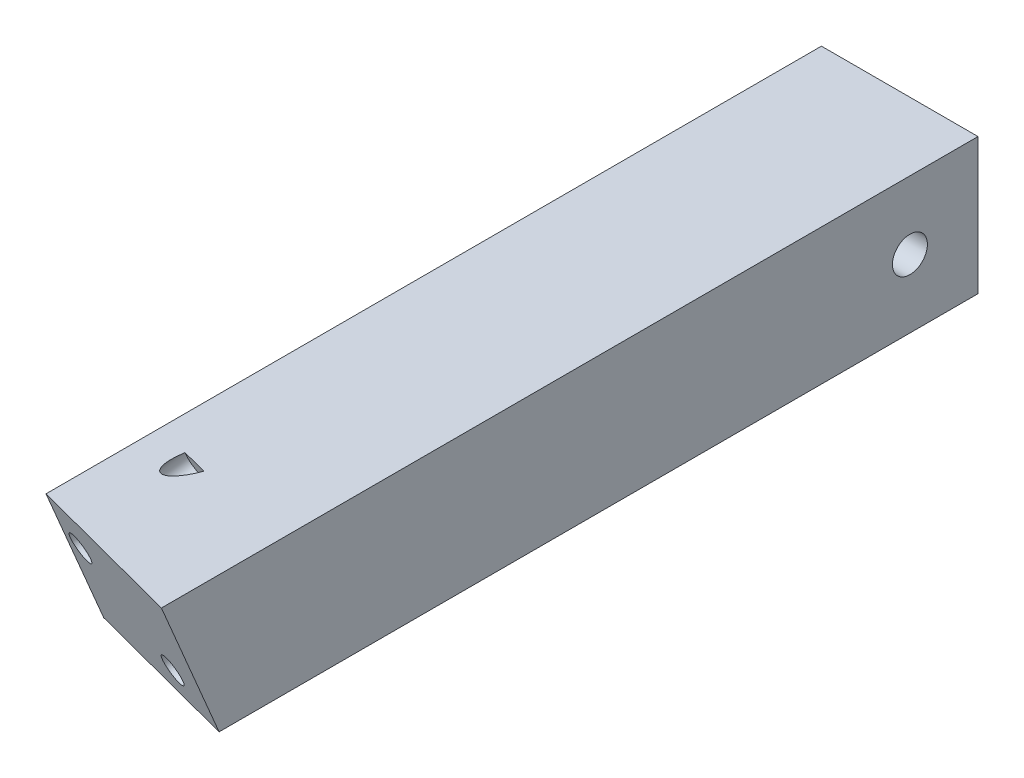
ISO-10303-21;
HEADER;
FILE_DESCRIPTION(('STEP AP214'),'2;1');
FILE_NAME('part.step','',(''),(''),'','','');
FILE_SCHEMA(('AUTOMOTIVE_DESIGN { 1 0 10303 214 1 1 1 1 }'));
ENDSEC;
DATA;
#1=APPLICATION_CONTEXT('core data for automotive mechanical design processes');
#2=APPLICATION_PROTOCOL_DEFINITION('international standard','automotive_design',2000,#1);
#3=PRODUCT_CONTEXT('',#1,'mechanical');
#4=PRODUCT('Part','Part','',(#3));
#5=PRODUCT_RELATED_PRODUCT_CATEGORY('part','',(#4));
#6=PRODUCT_DEFINITION_FORMATION('','',#4);
#7=PRODUCT_DEFINITION_CONTEXT('part definition',#1,'design');
#8=PRODUCT_DEFINITION('design','',#6,#7);
#9=PRODUCT_DEFINITION_SHAPE('','',#8);
#10=(LENGTH_UNIT() NAMED_UNIT(*) SI_UNIT(.MILLI.,.METRE.));
#11=(NAMED_UNIT(*) PLANE_ANGLE_UNIT() SI_UNIT($,.RADIAN.));
#12=(NAMED_UNIT(*) SI_UNIT($,.STERADIAN.) SOLID_ANGLE_UNIT());
#13=UNCERTAINTY_MEASURE_WITH_UNIT(LENGTH_MEASURE(1.E-05),#10,'distance_accuracy_value','');
#14=(GEOMETRIC_REPRESENTATION_CONTEXT(3) GLOBAL_UNCERTAINTY_ASSIGNED_CONTEXT((#13)) GLOBAL_UNIT_ASSIGNED_CONTEXT((#10,
#11,#12)) REPRESENTATION_CONTEXT('',''));
#15=CARTESIAN_POINT('',(0.,0.,0.));
#16=DIRECTION('',(0.,0.,1.));
#17=DIRECTION('',(1.,0.,0.));
#18=AXIS2_PLACEMENT_3D('',#15,#16,#17);
#19=CARTESIAN_POINT('',(14.605,-12.7,-12.7));
#20=DIRECTION('',(-1.,0.,0.));
#21=DIRECTION('',(0.,0.,-1.));
#22=AXIS2_PLACEMENT_3D('',#19,#20,#21);
#23=PLANE('',#22);
#24=CARTESIAN_POINT('',(14.605,0.,1.65999089474234E-13));
#25=DIRECTION('',(-1.,0.,0.));
#26=DIRECTION('',(0.,0.,1.));
#27=AXIS2_PLACEMENT_3D('',#24,#25,#26);
#28=CIRCLE('',#27,3.26389999999984);
#29=CARTESIAN_POINT('',(14.605,0.,3.26390000000001));
#30=VERTEX_POINT('',#29);
#31=EDGE_CURVE('E91',#30,#30,#28,.T.);
#32=ORIENTED_EDGE('',*,*,#31,.T.);
#33=EDGE_LOOP('',(#32));
#34=FACE_BOUND('',#33,.T.);
#35=DIRECTION('',(0.,0.,1.));
#36=VECTOR('',#35,1.);
#37=CARTESIAN_POINT('',(14.605,-12.7,-12.7));
#38=LINE('',#37,#36);
#39=CARTESIAN_POINT('',(14.605,-12.7,-12.7));
#40=VERTEX_POINT('',#39);
#41=CARTESIAN_POINT('',(14.605,-12.7,128.878017606949));
#42=VERTEX_POINT('',#41);
#43=EDGE_CURVE('E111',#40,#42,#38,.T.);
#44=ORIENTED_EDGE('',*,*,#43,.F.);
#45=DIRECTION('',(0.,1.,0.));
#46=VECTOR('',#45,1.);
#47=CARTESIAN_POINT('',(14.605,-12.7,-12.7));
#48=LINE('',#47,#46);
#49=CARTESIAN_POINT('',(14.605,12.7,-12.7));
#50=VERTEX_POINT('',#49);
#51=EDGE_CURVE('E110',#40,#50,#48,.T.);
#52=ORIENTED_EDGE('',*,*,#51,.T.);
#53=DIRECTION('',(0.,0.,1.));
#54=VECTOR('',#53,1.);
#55=CARTESIAN_POINT('',(14.605,12.7,-12.7));
#56=LINE('',#55,#54);
#57=CARTESIAN_POINT('',(14.605,12.7,139.643198338923));
#58=VERTEX_POINT('',#57);
#59=EDGE_CURVE('E46',#50,#58,#56,.T.);
#60=ORIENTED_EDGE('',*,*,#59,.T.);
#61=DIRECTION('',(0.,0.920719568766406,0.390224903985642));
#62=VECTOR('',#61,1.);
#63=CARTESIAN_POINT('',(14.605,2.57877644783799,135.353560513422));
#64=LINE('',#63,#62);
#65=EDGE_CURVE('E113',#42,#58,#64,.T.);
#66=ORIENTED_EDGE('',*,*,#65,.F.);
#67=EDGE_LOOP('',(#44,#52,#60,#66));
#68=FACE_BOUND('',#67,.T.);
#69=ADVANCED_FACE('F39',(#34,#68),#23,.F.);
#70=CARTESIAN_POINT('',(-14.605,12.7,-12.7));
#71=DIRECTION('',(0.,-1.,0.));
#72=DIRECTION('',(0.,0.,1.));
#73=AXIS2_PLACEMENT_3D('',#70,#71,#72);
#74=PLANE('',#73);
#75=DIRECTION('',(0.967127916637602,0.,0.254290371151193));
#76=VECTOR('',#75,1.);
#77=CARTESIAN_POINT('',(-44.9467533679522,12.7,102.697042322268));
#78=LINE('',#77,#76);
#79=CARTESIAN_POINT('',(-8.30064374781205,12.7,112.332533818524));
#80=VERTEX_POINT('',#79);
#81=CARTESIAN_POINT('',(-3.5413028396198,12.7,113.583924193219));
#82=VERTEX_POINT('',#81);
#83=EDGE_CURVE('E11',#80,#82,#78,.T.);
#84=ORIENTED_EDGE('',*,*,#83,.T.);
#85=CARTESIAN_POINT('',(-5.5341151368064,12.7,111.486913668085));
#86=DIRECTION('',(0.,1.,0.));
#87=DIRECTION('',(-0.254290371151193,0.,0.967127916637602));
#88=AXIS2_PLACEMENT_3D('',#85,#86,#87);
#89=ELLIPSE('',#88,6.66360306804543,2.52729999999977);
#90=EDGE_CURVE('E86',#80,#82,#89,.T.);
#91=ORIENTED_EDGE('',*,*,#90,.F.);
#92=EDGE_LOOP('',(#84,#91));
#93=FACE_BOUND('',#92,.T.);
#94=ORIENTED_EDGE('',*,*,#59,.F.);
#95=DIRECTION('',(-1.,0.,0.));
#96=VECTOR('',#95,1.);
#97=CARTESIAN_POINT('',(-14.605,12.7,-12.7));
#98=LINE('',#97,#96);
#99=CARTESIAN_POINT('',(-14.605,12.7,-12.7));
#100=VERTEX_POINT('',#99);
#101=EDGE_CURVE('E102',#50,#100,#98,.T.);
#102=ORIENTED_EDGE('',*,*,#101,.T.);
#103=DIRECTION('',(0.,0.,1.));
#104=VECTOR('',#103,1.);
#105=CARTESIAN_POINT('',(-14.605,12.7,-12.7));
#106=LINE('',#105,#104);
#107=CARTESIAN_POINT('',(-14.605,12.7,131.962909502726));
#108=VERTEX_POINT('',#107);
#109=EDGE_CURVE('E108',#100,#108,#106,.T.);
#110=ORIENTED_EDGE('',*,*,#109,.T.);
#111=DIRECTION('',(-0.967127916637602,0.,-0.254290371151193));
#112=VECTOR('',#111,1.);
#113=CARTESIAN_POINT('',(-4.90539656623421,12.7,134.513260614259));
#114=LINE('',#113,#112);
#115=EDGE_CURVE('E104',#58,#108,#114,.T.);
#116=ORIENTED_EDGE('',*,*,#115,.F.);
#117=EDGE_LOOP('',(#94,#102,#110,#116));
#118=FACE_BOUND('',#117,.T.);
#119=ADVANCED_FACE('F93',(#93,#118),#74,.F.);
#120=CARTESIAN_POINT('',(-14.605,-12.7,-12.7));
#121=DIRECTION('',(1.,0.,0.));
#122=DIRECTION('',(0.,0.,1.));
#123=AXIS2_PLACEMENT_3D('',#120,#121,#122);
#124=PLANE('',#123);
#125=CARTESIAN_POINT('',(-14.605,0.,1.65999089474234E-13));
#126=DIRECTION('',(-1.,0.,0.));
#127=DIRECTION('',(0.,0.,1.));
#128=AXIS2_PLACEMENT_3D('',#125,#126,#127);
#129=CIRCLE('',#128,3.26389999999984);
#130=CARTESIAN_POINT('',(-14.605,0.,3.26390000000001));
#131=VERTEX_POINT('',#130);
#132=EDGE_CURVE('E135',#131,#131,#129,.T.);
#133=ORIENTED_EDGE('',*,*,#132,.F.);
#134=EDGE_LOOP('',(#133));
#135=FACE_BOUND('',#134,.T.);
#136=ORIENTED_EDGE('',*,*,#109,.F.);
#137=DIRECTION('',(0.,-1.,0.));
#138=VECTOR('',#137,1.);
#139=CARTESIAN_POINT('',(-14.605,-12.7,-12.7));
#140=LINE('',#139,#138);
#141=CARTESIAN_POINT('',(-14.605,-12.7,-12.7));
#142=VERTEX_POINT('',#141);
#143=EDGE_CURVE('E115',#100,#142,#140,.T.);
#144=ORIENTED_EDGE('',*,*,#143,.T.);
#145=DIRECTION('',(0.,0.,1.));
#146=VECTOR('',#145,1.);
#147=CARTESIAN_POINT('',(-14.605,-12.7,-12.7));
#148=LINE('',#147,#146);
#149=CARTESIAN_POINT('',(-14.605,-12.7,121.197728770752));
#150=VERTEX_POINT('',#149);
#151=EDGE_CURVE('E127',#142,#150,#148,.T.);
#152=ORIENTED_EDGE('',*,*,#151,.T.);
#153=DIRECTION('',(0.,-0.920719568766406,-0.390224903985642));
#154=VECTOR('',#153,1.);
#155=CARTESIAN_POINT('',(-14.605,5.33820979998677,128.842791313198));
#156=LINE('',#155,#154);
#157=EDGE_CURVE('E120',#108,#150,#156,.T.);
#158=ORIENTED_EDGE('',*,*,#157,.F.);
#159=EDGE_LOOP('',(#136,#144,#152,#158));
#160=FACE_BOUND('',#159,.T.);
#161=ADVANCED_FACE('F96',(#135,#160),#124,.F.);
#162=CARTESIAN_POINT('',(-14.605,-12.7,-12.7));
#163=DIRECTION('',(0.,1.,0.));
#164=DIRECTION('',(0.,0.,-1.));
#165=AXIS2_PLACEMENT_3D('',#162,#163,#164);
#166=PLANE('',#165);
#167=ORIENTED_EDGE('',*,*,#151,.F.);
#168=DIRECTION('',(1.,0.,0.));
#169=VECTOR('',#168,1.);
#170=CARTESIAN_POINT('',(-14.605,-12.7,-12.7));
#171=LINE('',#170,#169);
#172=EDGE_CURVE('E60',#142,#40,#171,.T.);
#173=ORIENTED_EDGE('',*,*,#172,.T.);
#174=ORIENTED_EDGE('',*,*,#43,.T.);
#175=DIRECTION('',(0.967127916637602,0.,0.254290371151193));
#176=VECTOR('',#175,1.);
#177=CARTESIAN_POINT('',(-2.25790149244991,-12.7,124.444195146204));
#178=LINE('',#177,#176);
#179=EDGE_CURVE('E117',#150,#42,#178,.T.);
#180=ORIENTED_EDGE('',*,*,#179,.F.);
#181=EDGE_LOOP('',(#167,#173,#174,#180));
#182=FACE_BOUND('',#181,.T.);
#183=ADVANCED_FACE('F140',(#182),#166,.F.);
#184=CARTESIAN_POINT('',(0.,0.,-12.7));
#185=DIRECTION('',(0.,0.,1.));
#186=DIRECTION('',(-1.,0.,0.));
#187=AXIS2_PLACEMENT_3D('',#184,#185,#186);
#188=PLANE('',#187);
#189=ORIENTED_EDGE('',*,*,#51,.F.);
#190=ORIENTED_EDGE('',*,*,#172,.F.);
#191=ORIENTED_EDGE('',*,*,#143,.F.);
#192=ORIENTED_EDGE('',*,*,#101,.F.);
#193=EDGE_LOOP('',(#189,#190,#191,#192));
#194=FACE_BOUND('',#193,.T.);
#195=ADVANCED_FACE('F142',(#194),#188,.F.);
#196=CARTESIAN_POINT('',(-280.001206524606,681.736801445706,345.736544365799));
#197=DIRECTION('',(-0.235291406157399,-0.379269289330745,0.894870247778428));
#198=DIRECTION('',(0.,0.920719568766406,0.390224903985642));
#199=AXIS2_PLACEMENT_3D('',#196,#197,#198);
#200=PLANE('',#199);
#201=CARTESIAN_POINT('',(-10.3476268944492,4.94103755712552,129.793865586102));
#202=DIRECTION('',(0.235291406157399,0.379269289330746,-0.894870247778428));
#203=DIRECTION('',(0.,0.920719568766405,0.390224903985643));
#204=AXIS2_PLACEMENT_3D('',#201,#202,#203);
#205=CIRCLE('',#204,2.52729999999977);
#206=CARTESIAN_POINT('',(-10.3476268944492,7.26797212326864,130.780080985945));
#207=VERTEX_POINT('',#206);
#208=EDGE_CURVE('E87',#207,#207,#205,.T.);
#209=ORIENTED_EDGE('',*,*,#208,.T.);
#210=EDGE_LOOP('',(#209));
#211=FACE_BOUND('',#210,.T.);
#212=CARTESIAN_POINT('',(6.25664835183116,-6.77409955029028,129.194506678426));
#213=DIRECTION('',(0.235291406157399,0.379269289330746,-0.894870247778428));
#214=DIRECTION('',(0.,0.920719568766405,0.390224903985643));
#215=AXIS2_PLACEMENT_3D('',#212,#213,#214);
#216=CIRCLE('',#215,2.52729999999977);
#217=CARTESIAN_POINT('',(6.25664835183116,-4.44716498414716,130.180722078269));
#218=VERTEX_POINT('',#217);
#219=EDGE_CURVE('E242',#218,#218,#216,.T.);
#220=ORIENTED_EDGE('',*,*,#219,.T.);
#221=EDGE_LOOP('',(#220));
#222=FACE_BOUND('',#221,.T.);
#223=ORIENTED_EDGE('',*,*,#65,.T.);
#224=ORIENTED_EDGE('',*,*,#115,.T.);
#225=ORIENTED_EDGE('',*,*,#157,.T.);
#226=ORIENTED_EDGE('',*,*,#179,.T.);
#227=EDGE_LOOP('',(#223,#224,#225,#226));
#228=FACE_BOUND('',#227,.T.);
#229=ADVANCED_FACE('F134',(#211,#222,#228),#200,.T.);
#230=CARTESIAN_POINT('',(-14.605,0.,1.65999089474234E-13));
#231=DIRECTION('',(1.,0.,0.));
#232=DIRECTION('',(0.,0.,1.));
#233=AXIS2_PLACEMENT_3D('',#230,#231,#232);
#234=CYLINDRICAL_SURFACE('',#233,3.26389999999984);
#235=CARTESIAN_POINT('',(-14.605,0.,3.26390000000001));
#236=CARTESIAN_POINT('',(-14.3007291666667,0.,3.26390000000001));
#237=CARTESIAN_POINT('',(-13.9964583333333,0.,3.26390000000001));
#238=CARTESIAN_POINT('',(-13.3879166666667,0.,3.26390000000001));
#239=CARTESIAN_POINT('',(-13.0836458333333,0.,3.26390000000001));
#240=CARTESIAN_POINT('',(-12.4751041666667,0.,3.26390000000001));
#241=CARTESIAN_POINT('',(-12.1708333333333,0.,3.26390000000001));
#242=CARTESIAN_POINT('',(-11.5622916666667,0.,3.26390000000001));
#243=CARTESIAN_POINT('',(-11.2580208333333,0.,3.26390000000001));
#244=CARTESIAN_POINT('',(-10.6494791666667,0.,3.26390000000001));
#245=CARTESIAN_POINT('',(-10.3452083333333,0.,3.26390000000001));
#246=CARTESIAN_POINT('',(-9.73666666666666,0.,3.26390000000001));
#247=CARTESIAN_POINT('',(-9.43239583333332,0.,3.26390000000001));
#248=CARTESIAN_POINT('',(-8.82385416666666,0.,3.26390000000001));
#249=CARTESIAN_POINT('',(-8.51958333333332,0.,3.26390000000001));
#250=CARTESIAN_POINT('',(-7.91104166666666,0.,3.26390000000001));
#251=CARTESIAN_POINT('',(-7.60677083333333,0.,3.26390000000001));
#252=CARTESIAN_POINT('',(-6.99822916666666,0.,3.26390000000001));
#253=CARTESIAN_POINT('',(-6.69395833333332,0.,3.26390000000001));
#254=CARTESIAN_POINT('',(-6.08541666666666,0.,3.26390000000001));
#255=CARTESIAN_POINT('',(-5.78114583333333,0.,3.26390000000001));
#256=CARTESIAN_POINT('',(-5.17260416666666,0.,3.26390000000001));
#257=CARTESIAN_POINT('',(-4.86833333333333,0.,3.26390000000001));
#258=CARTESIAN_POINT('',(-4.25979166666666,0.,3.26390000000001));
#259=CARTESIAN_POINT('',(-3.95552083333333,0.,3.26390000000001));
#260=CARTESIAN_POINT('',(-3.34697916666666,0.,3.26390000000001));
#261=CARTESIAN_POINT('',(-3.04270833333333,0.,3.26390000000001));
#262=CARTESIAN_POINT('',(-2.43416666666666,0.,3.26390000000001));
#263=CARTESIAN_POINT('',(-2.12989583333333,0.,3.26390000000001));
#264=CARTESIAN_POINT('',(-1.52135416666666,0.,3.26390000000001));
#265=CARTESIAN_POINT('',(-1.21708333333333,0.,3.26390000000001));
#266=CARTESIAN_POINT('',(-0.60854166666666,0.,3.26390000000001));
#267=CARTESIAN_POINT('',(-0.304270833333327,0.,3.26390000000001));
#268=CARTESIAN_POINT('',(0.30427083333334,0.,3.26390000000001));
#269=CARTESIAN_POINT('',(0.608541666666674,0.,3.26390000000001));
#270=CARTESIAN_POINT('',(1.21708333333334,0.,3.26390000000001));
#271=CARTESIAN_POINT('',(1.52135416666667,0.,3.26390000000001));
#272=CARTESIAN_POINT('',(2.12989583333334,0.,3.26390000000001));
#273=CARTESIAN_POINT('',(2.43416666666667,0.,3.26390000000001));
#274=CARTESIAN_POINT('',(3.04270833333334,0.,3.26390000000001));
#275=CARTESIAN_POINT('',(3.34697916666667,0.,3.26390000000001));
#276=CARTESIAN_POINT('',(3.95552083333334,0.,3.26390000000001));
#277=CARTESIAN_POINT('',(4.25979166666667,0.,3.26390000000001));
#278=CARTESIAN_POINT('',(4.86833333333334,0.,3.26390000000001));
#279=CARTESIAN_POINT('',(5.17260416666667,0.,3.26390000000001));
#280=CARTESIAN_POINT('',(5.78114583333334,0.,3.26390000000001));
#281=CARTESIAN_POINT('',(6.08541666666667,0.,3.26390000000001));
#282=CARTESIAN_POINT('',(6.69395833333334,0.,3.26390000000001));
#283=CARTESIAN_POINT('',(6.99822916666667,0.,3.26390000000001));
#284=CARTESIAN_POINT('',(7.60677083333334,0.,3.26390000000001));
#285=CARTESIAN_POINT('',(7.91104166666667,0.,3.26390000000001));
#286=CARTESIAN_POINT('',(8.51958333333334,0.,3.26390000000001));
#287=CARTESIAN_POINT('',(8.82385416666667,0.,3.26390000000001));
#288=CARTESIAN_POINT('',(9.43239583333334,0.,3.26390000000001));
#289=CARTESIAN_POINT('',(9.73666666666667,0.,3.26390000000001));
#290=CARTESIAN_POINT('',(10.3452083333333,0.,3.26390000000001));
#291=CARTESIAN_POINT('',(10.6494791666667,0.,3.26390000000001));
#292=CARTESIAN_POINT('',(11.2580208333333,0.,3.26390000000001));
#293=CARTESIAN_POINT('',(11.5622916666667,0.,3.26390000000001));
#294=CARTESIAN_POINT('',(12.1708333333333,0.,3.26390000000001));
#295=CARTESIAN_POINT('',(12.4751041666667,0.,3.26390000000001));
#296=CARTESIAN_POINT('',(13.0836458333333,0.,3.26390000000001));
#297=CARTESIAN_POINT('',(13.3879166666667,0.,3.26390000000001));
#298=CARTESIAN_POINT('',(13.9964583333333,0.,3.26390000000001));
#299=CARTESIAN_POINT('',(14.3007291666667,0.,3.26390000000001));
#300=CARTESIAN_POINT('',(14.605,0.,3.26390000000001));
#301=B_SPLINE_CURVE_WITH_KNOTS('',3,(#235,#236,#237,#238,#239,#240,#241,#242,#243,#244,#245,
#246,#247,#248,#249,#250,#251,#252,#253,#254,#255,#256,#257,#258,#259,#260,#261,#262,#263,#264,
#265,#266,#267,#268,#269,#270,#271,#272,#273,#274,#275,#276,#277,#278,#279,#280,#281,#282,#283,
#284,#285,#286,#287,#288,#289,#290,#291,#292,#293,#294,#295,#296,#297,#298,#299,#300),
.UNSPECIFIED.,.F.,.F.,(4,2,2,2,2,2,2,2,2,2,2,2,2,2,2,2,2,2,2,2,2,2,2,2,2,2,2,2,2,2,2,2,4),(0.,
0.9128125,1.825625,2.7384375,3.65125,4.5640625,5.476875,6.3896875,7.3025,8.2153125,9.128125,
10.0409375,10.95375,11.8665625,12.779375,13.6921875,14.605,15.5178125,16.430625,17.3434375,
18.25625,19.1690625,20.081875,20.9946875,21.9075,22.8203125,23.733125,24.6459375,25.55875,
26.4715625,27.384375,28.2971875,29.21),.UNSPECIFIED.);
#302=EDGE_CURVE('BSEAM158',#131,#30,#301,.T.);
#303=ORIENTED_EDGE('',*,*,#132,.T.);
#304=ORIENTED_EDGE('',*,*,#31,.F.);
#305=ORIENTED_EDGE('',*,*,#302,.T.);
#306=ORIENTED_EDGE('',*,*,#302,.F.);
#307=EDGE_LOOP('',(#303,#305,#304,#306));
#308=FACE_BOUND('',#307,.T.);
#309=ADVANCED_FACE('F158',(#308),#234,.F.);
#310=CARTESIAN_POINT('',(10.7389496391296,0.450980411460427,112.147228458247));
#311=DIRECTION('',(-0.235291406157399,-0.379269289330746,0.894870247778428));
#312=DIRECTION('',(0.,0.920719568766406,0.390224903985643));
#313=AXIS2_PLACEMENT_3D('',#310,#311,#312);
#314=CYLINDRICAL_SURFACE('',#313,2.52729999999977);
#315=CARTESIAN_POINT('',(10.7389496391296,0.450980411460427,112.147228458247));
#316=DIRECTION('',(0.235291406157399,0.379269289330746,-0.894870247778428));
#317=DIRECTION('',(0.,0.920719568766405,0.390224903985643));
#318=AXIS2_PLACEMENT_3D('',#315,#316,#317);
#319=CIRCLE('',#318,2.52729999999977);
#320=CARTESIAN_POINT('',(10.7389496391296,2.77791497760355,113.13344385809));
#321=VERTEX_POINT('',#320);
#322=EDGE_CURVE('E245',#321,#321,#319,.T.);
#323=ORIENTED_EDGE('',*,*,#322,.T.);
#324=EDGE_LOOP('',(#323));
#325=FACE_BOUND('',#324,.T.);
#326=ORIENTED_EDGE('',*,*,#219,.F.);
#327=EDGE_LOOP('',(#326));
#328=FACE_BOUND('',#327,.T.);
#329=ADVANCED_FACE('F160',(#325,#328),#314,.F.);
#330=CARTESIAN_POINT('',(10.7389496391296,0.450980411460427,112.147228458247));
#331=DIRECTION('',(-0.235291406157399,-0.379269289330746,0.894870247778428));
#332=DIRECTION('',(0.,0.920719568766405,0.390224903985643));
#333=AXIS2_PLACEMENT_3D('',#330,#331,#332);
#334=PLANE('',#333);
#335=ORIENTED_EDGE('',*,*,#322,.F.);
#336=EDGE_LOOP('',(#335));
#337=FACE_BOUND('',#336,.T.);
#338=ADVANCED_FACE('F167',(#337),#334,.T.);
#339=CARTESIAN_POINT('',(-5.86532560715077,12.1661175188762,112.746587365923));
#340=DIRECTION('',(-0.235291406157399,-0.379269289330746,0.894870247778428));
#341=DIRECTION('',(0.,0.920719568766405,0.390224903985643));
#342=AXIS2_PLACEMENT_3D('',#339,#340,#341);
#343=PLANE('',#342);
#344=ORIENTED_EDGE('',*,*,#83,.F.);
#345=CARTESIAN_POINT('',(-5.86532560715077,12.1661175188762,112.746587365923));
#346=DIRECTION('',(0.235291406157399,0.379269289330746,-0.894870247778428));
#347=DIRECTION('',(0.,0.920719568766405,0.390224903985643));
#348=AXIS2_PLACEMENT_3D('',#345,#346,#347);
#349=CIRCLE('',#348,2.52729999999977);
#350=EDGE_CURVE('E52',#82,#80,#349,.T.);
#351=ORIENTED_EDGE('',*,*,#350,.F.);
#352=EDGE_LOOP('',(#344,#351));
#353=FACE_BOUND('',#352,.T.);
#354=ADVANCED_FACE('F85',(#353),#343,.T.);
#355=CARTESIAN_POINT('',(-5.86532560715077,12.1661175188762,112.746587365923));
#356=DIRECTION('',(-0.235291406157399,-0.379269289330746,0.894870247778428));
#357=DIRECTION('',(0.,0.920719568766406,0.390224903985643));
#358=AXIS2_PLACEMENT_3D('',#355,#356,#357);
#359=CYLINDRICAL_SURFACE('',#358,2.52729999999977);
#360=ORIENTED_EDGE('',*,*,#208,.F.);
#361=EDGE_LOOP('',(#360));
#362=FACE_BOUND('',#361,.T.);
#363=ORIENTED_EDGE('',*,*,#350,.T.);
#364=ORIENTED_EDGE('',*,*,#90,.T.);
#365=EDGE_LOOP('',(#363,#364));
#366=FACE_BOUND('',#365,.T.);
#367=ADVANCED_FACE('F89',(#362,#366),#359,.F.);
#368=CLOSED_SHELL('',(#69,#119,#161,#183,#195,#229,#309,#329,#338,#354,#367));
#369=MANIFOLD_SOLID_BREP('B2',#368);
#370=ADVANCED_BREP_SHAPE_REPRESENTATION('',(#18,#369),#14);
#371=SHAPE_DEFINITION_REPRESENTATION(#9,#370);
ENDSEC;
END-ISO-10303-21;
